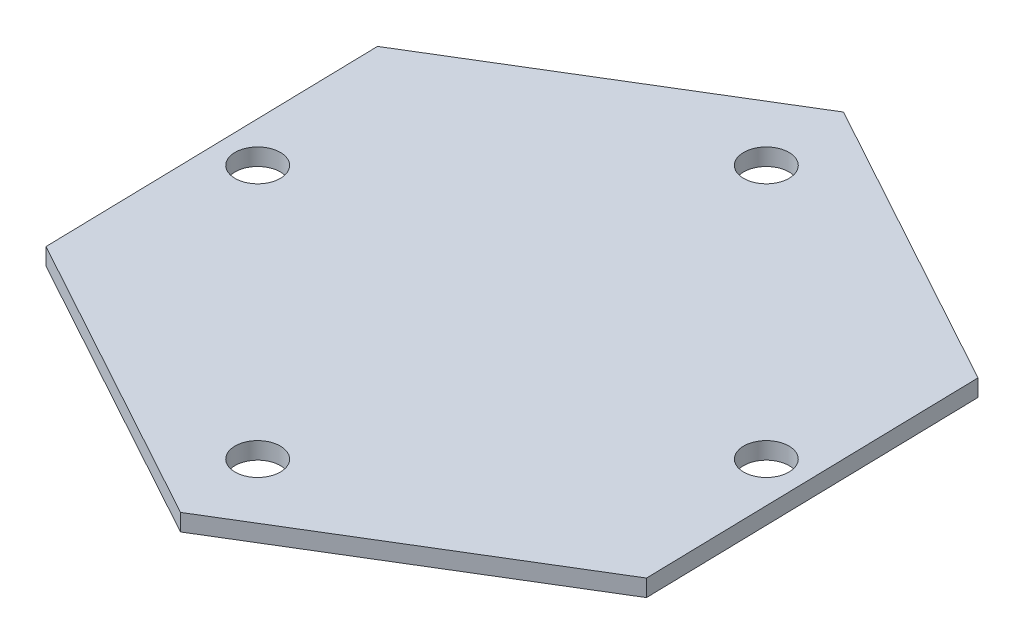
ISO-10303-21;
HEADER;
FILE_DESCRIPTION(('STEP AP214'),'2;1');
FILE_NAME('part.step','',(''),(''),'','','');
FILE_SCHEMA(('AUTOMOTIVE_DESIGN { 1 0 10303 214 1 1 1 1 }'));
ENDSEC;
DATA;
#1=APPLICATION_CONTEXT('core data for automotive mechanical design processes');
#2=APPLICATION_PROTOCOL_DEFINITION('international standard','automotive_design',2000,#1);
#3=PRODUCT_CONTEXT('',#1,'mechanical');
#4=PRODUCT('Part','Part','',(#3));
#5=PRODUCT_RELATED_PRODUCT_CATEGORY('part','',(#4));
#6=PRODUCT_DEFINITION_FORMATION('','',#4);
#7=PRODUCT_DEFINITION_CONTEXT('part definition',#1,'design');
#8=PRODUCT_DEFINITION('design','',#6,#7);
#9=PRODUCT_DEFINITION_SHAPE('','',#8);
#10=(LENGTH_UNIT() NAMED_UNIT(*) SI_UNIT(.MILLI.,.METRE.));
#11=(NAMED_UNIT(*) PLANE_ANGLE_UNIT() SI_UNIT($,.RADIAN.));
#12=(NAMED_UNIT(*) SI_UNIT($,.STERADIAN.) SOLID_ANGLE_UNIT());
#13=UNCERTAINTY_MEASURE_WITH_UNIT(LENGTH_MEASURE(1.E-05),#10,'distance_accuracy_value','');
#14=(GEOMETRIC_REPRESENTATION_CONTEXT(3) GLOBAL_UNCERTAINTY_ASSIGNED_CONTEXT((#13)) GLOBAL_UNIT_ASSIGNED_CONTEXT((#10,
#11,#12)) REPRESENTATION_CONTEXT('',''));
#15=CARTESIAN_POINT('',(0.,0.,0.));
#16=DIRECTION('',(0.,0.,1.));
#17=DIRECTION('',(1.,0.,0.));
#18=AXIS2_PLACEMENT_3D('',#15,#16,#17);
#19=CARTESIAN_POINT('',(1.34483275867379,3.,60.));
#20=DIRECTION('',(-0.519280566658144,0.,-0.854603822300835));
#21=DIRECTION('',(-0.854603822300835,0.,0.519280566658144));
#22=AXIS2_PLACEMENT_3D('',#19,#20,#21);
#23=PLANE('',#22);
#24=DIRECTION('',(0.854603822300835,0.,-0.519280566658144));
#25=VECTOR('',#24,1.);
#26=CARTESIAN_POINT('',(1.34483275867379,0.,60.));
#27=LINE('',#26,#25);
#28=CARTESIAN_POINT('',(1.34483275867379,0.,60.));
#29=VERTEX_POINT('',#28);
#30=CARTESIAN_POINT('',(52.6339406064032,0.,28.835340667147));
#31=VERTEX_POINT('',#30);
#32=EDGE_CURVE('E138',#29,#31,#27,.T.);
#33=ORIENTED_EDGE('',*,*,#32,.T.);
#34=DIRECTION('',(0.,-1.,0.));
#35=VECTOR('',#34,1.);
#36=CARTESIAN_POINT('',(52.6339406064032,3.,28.835340667147));
#37=LINE('',#36,#35);
#38=CARTESIAN_POINT('',(52.6339406064032,3.,28.835340667147));
#39=VERTEX_POINT('',#38);
#40=EDGE_CURVE('E11',#39,#31,#37,.T.);
#41=ORIENTED_EDGE('',*,*,#40,.F.);
#42=DIRECTION('',(0.854603822300835,0.,-0.519280566658144));
#43=VECTOR('',#42,1.);
#44=CARTESIAN_POINT('',(1.34483275867379,3.,60.));
#45=LINE('',#44,#43);
#46=CARTESIAN_POINT('',(1.34483275867379,3.,60.));
#47=VERTEX_POINT('',#46);
#48=EDGE_CURVE('E155',#47,#39,#45,.T.);
#49=ORIENTED_EDGE('',*,*,#48,.F.);
#50=DIRECTION('',(0.,-1.,0.));
#51=VECTOR('',#50,1.);
#52=CARTESIAN_POINT('',(1.34483275867379,3.,60.));
#53=LINE('',#52,#51);
#54=EDGE_CURVE('E134',#47,#29,#53,.T.);
#55=ORIENTED_EDGE('',*,*,#54,.T.);
#56=EDGE_LOOP('',(#33,#41,#49,#55));
#57=FACE_BOUND('',#56,.T.);
#58=ADVANCED_FACE('F49',(#57),#23,.F.);
#59=CARTESIAN_POINT('',(52.6339406064032,3.,28.835340667147));
#60=DIRECTION('',(-0.999748903612877,0.,0.0224082512671135));
#61=DIRECTION('',(0.0224082512671135,0.,0.999748903612877));
#62=AXIS2_PLACEMENT_3D('',#59,#60,#61);
#63=PLANE('',#62);
#64=DIRECTION('',(-0.0224082512671135,0.,-0.999748903612877));
#65=VECTOR('',#64,1.);
#66=CARTESIAN_POINT('',(52.6339406064032,0.,28.835340667147));
#67=LINE('',#66,#65);
#68=CARTESIAN_POINT('',(51.2891078477294,0.,-31.164659332853));
#69=VERTEX_POINT('',#68);
#70=EDGE_CURVE('E142',#31,#69,#67,.T.);
#71=ORIENTED_EDGE('',*,*,#70,.T.);
#72=DIRECTION('',(0.,-1.,0.));
#73=VECTOR('',#72,1.);
#74=CARTESIAN_POINT('',(51.2891078477294,3.,-31.164659332853));
#75=LINE('',#74,#73);
#76=CARTESIAN_POINT('',(51.2891078477294,3.,-31.164659332853));
#77=VERTEX_POINT('',#76);
#78=EDGE_CURVE('E58',#77,#69,#75,.T.);
#79=ORIENTED_EDGE('',*,*,#78,.F.);
#80=DIRECTION('',(-0.0224082512671135,0.,-0.999748903612877));
#81=VECTOR('',#80,1.);
#82=CARTESIAN_POINT('',(52.6339406064032,3.,28.835340667147));
#83=LINE('',#82,#81);
#84=EDGE_CURVE('E103',#39,#77,#83,.T.);
#85=ORIENTED_EDGE('',*,*,#84,.F.);
#86=ORIENTED_EDGE('',*,*,#40,.T.);
#87=EDGE_LOOP('',(#71,#79,#85,#86));
#88=FACE_BOUND('',#87,.T.);
#89=ADVANCED_FACE('F185',(#88),#63,.F.);
#90=CARTESIAN_POINT('',(51.2891078477294,3.,-31.164659332853));
#91=DIRECTION('',(-0.480468336954733,0.,0.877012073567948));
#92=DIRECTION('',(0.877012073567949,0.,0.480468336954734));
#93=AXIS2_PLACEMENT_3D('',#90,#91,#92);
#94=PLANE('',#93);
#95=DIRECTION('',(-0.877012073567949,0.,-0.480468336954734));
#96=VECTOR('',#95,1.);
#97=CARTESIAN_POINT('',(51.2891078477294,0.,-31.164659332853));
#98=LINE('',#97,#96);
#99=CARTESIAN_POINT('',(-1.34483275867379,0.,-60.));
#100=VERTEX_POINT('',#99);
#101=EDGE_CURVE('E146',#69,#100,#98,.T.);
#102=ORIENTED_EDGE('',*,*,#101,.T.);
#103=DIRECTION('',(0.,-1.,0.));
#104=VECTOR('',#103,1.);
#105=CARTESIAN_POINT('',(-1.34483275867379,3.,-60.));
#106=LINE('',#105,#104);
#107=CARTESIAN_POINT('',(-1.34483275867379,3.,-60.));
#108=VERTEX_POINT('',#107);
#109=EDGE_CURVE('E127',#108,#100,#106,.T.);
#110=ORIENTED_EDGE('',*,*,#109,.F.);
#111=DIRECTION('',(-0.877012073567949,0.,-0.480468336954734));
#112=VECTOR('',#111,1.);
#113=CARTESIAN_POINT('',(51.2891078477294,3.,-31.164659332853));
#114=LINE('',#113,#112);
#115=EDGE_CURVE('E116',#77,#108,#114,.T.);
#116=ORIENTED_EDGE('',*,*,#115,.F.);
#117=ORIENTED_EDGE('',*,*,#78,.T.);
#118=EDGE_LOOP('',(#102,#110,#116,#117));
#119=FACE_BOUND('',#118,.T.);
#120=ADVANCED_FACE('F165',(#119),#94,.F.);
#121=CARTESIAN_POINT('',(-1.34483275867379,3.,-60.));
#122=DIRECTION('',(0.519280566658144,0.,0.854603822300835));
#123=DIRECTION('',(0.854603822300835,0.,-0.519280566658144));
#124=AXIS2_PLACEMENT_3D('',#121,#122,#123);
#125=PLANE('',#124);
#126=DIRECTION('',(-0.854603822300835,0.,0.519280566658144));
#127=VECTOR('',#126,1.);
#128=CARTESIAN_POINT('',(-1.34483275867379,0.,-60.));
#129=LINE('',#128,#127);
#130=CARTESIAN_POINT('',(-52.6339406064032,0.,-28.835340667147));
#131=VERTEX_POINT('',#130);
#132=EDGE_CURVE('E125',#100,#131,#129,.T.);
#133=ORIENTED_EDGE('',*,*,#132,.T.);
#134=DIRECTION('',(0.,-1.,0.));
#135=VECTOR('',#134,1.);
#136=CARTESIAN_POINT('',(-52.6339406064032,3.,-28.835340667147));
#137=LINE('',#136,#135);
#138=CARTESIAN_POINT('',(-52.6339406064032,3.,-28.835340667147));
#139=VERTEX_POINT('',#138);
#140=EDGE_CURVE('E122',#139,#131,#137,.T.);
#141=ORIENTED_EDGE('',*,*,#140,.F.);
#142=DIRECTION('',(-0.854603822300835,0.,0.519280566658144));
#143=VECTOR('',#142,1.);
#144=CARTESIAN_POINT('',(-1.34483275867379,3.,-60.));
#145=LINE('',#144,#143);
#146=EDGE_CURVE('E110',#108,#139,#145,.T.);
#147=ORIENTED_EDGE('',*,*,#146,.F.);
#148=ORIENTED_EDGE('',*,*,#109,.T.);
#149=EDGE_LOOP('',(#133,#141,#147,#148));
#150=FACE_BOUND('',#149,.T.);
#151=ADVANCED_FACE('F123',(#150),#125,.F.);
#152=CARTESIAN_POINT('',(-52.6339406064032,3.,-28.835340667147));
#153=DIRECTION('',(0.999748903612877,0.,-0.0224082512671132));
#154=DIRECTION('',(-0.0224082512671132,0.,-0.999748903612877));
#155=AXIS2_PLACEMENT_3D('',#152,#153,#154);
#156=PLANE('',#155);
#157=DIRECTION('',(0.0224082512671132,0.,0.999748903612877));
#158=VECTOR('',#157,1.);
#159=CARTESIAN_POINT('',(-52.6339406064032,0.,-28.835340667147));
#160=LINE('',#159,#158);
#161=CARTESIAN_POINT('',(-51.2891078477294,0.,31.164659332853));
#162=VERTEX_POINT('',#161);
#163=EDGE_CURVE('E89',#131,#162,#160,.T.);
#164=ORIENTED_EDGE('',*,*,#163,.T.);
#165=DIRECTION('',(0.,-1.,0.));
#166=VECTOR('',#165,1.);
#167=CARTESIAN_POINT('',(-51.2891078477294,3.,31.164659332853));
#168=LINE('',#167,#166);
#169=CARTESIAN_POINT('',(-51.2891078477294,3.,31.164659332853));
#170=VERTEX_POINT('',#169);
#171=EDGE_CURVE('E128',#170,#162,#168,.T.);
#172=ORIENTED_EDGE('',*,*,#171,.F.);
#173=DIRECTION('',(0.0224082512671132,0.,0.999748903612877));
#174=VECTOR('',#173,1.);
#175=CARTESIAN_POINT('',(-52.6339406064032,3.,-28.835340667147));
#176=LINE('',#175,#174);
#177=EDGE_CURVE('E114',#139,#170,#176,.T.);
#178=ORIENTED_EDGE('',*,*,#177,.F.);
#179=ORIENTED_EDGE('',*,*,#140,.T.);
#180=EDGE_LOOP('',(#164,#172,#178,#179));
#181=FACE_BOUND('',#180,.T.);
#182=ADVANCED_FACE('F130',(#181),#156,.F.);
#183=CARTESIAN_POINT('',(-51.2891078477294,3.,31.164659332853));
#184=DIRECTION('',(0.480468336954733,0.,-0.877012073567948));
#185=DIRECTION('',(-0.877012073567949,0.,-0.480468336954734));
#186=AXIS2_PLACEMENT_3D('',#183,#184,#185);
#187=PLANE('',#186);
#188=DIRECTION('',(0.877012073567949,0.,0.480468336954734));
#189=VECTOR('',#188,1.);
#190=CARTESIAN_POINT('',(-51.2891078477294,0.,31.164659332853));
#191=LINE('',#190,#189);
#192=EDGE_CURVE('E95',#162,#29,#191,.T.);
#193=ORIENTED_EDGE('',*,*,#192,.T.);
#194=ORIENTED_EDGE('',*,*,#54,.F.);
#195=DIRECTION('',(0.877012073567949,0.,0.480468336954734));
#196=VECTOR('',#195,1.);
#197=CARTESIAN_POINT('',(-51.2891078477294,3.,31.164659332853));
#198=LINE('',#197,#196);
#199=EDGE_CURVE('E66',#170,#47,#198,.T.);
#200=ORIENTED_EDGE('',*,*,#199,.F.);
#201=ORIENTED_EDGE('',*,*,#171,.T.);
#202=EDGE_LOOP('',(#193,#194,#200,#201));
#203=FACE_BOUND('',#202,.T.);
#204=ADVANCED_FACE('F172',(#203),#187,.F.);
#205=CARTESIAN_POINT('',(0.,3.,0.));
#206=DIRECTION('',(0.,1.,0.));
#207=DIRECTION('',(0.,0.,1.));
#208=AXIS2_PLACEMENT_3D('',#205,#206,#207);
#209=PLANE('',#208);
#210=CARTESIAN_POINT('',(-45.,3.,0.));
#211=DIRECTION('',(0.,1.,0.));
#212=DIRECTION('',(0.,0.,1.));
#213=AXIS2_PLACEMENT_3D('',#210,#211,#212);
#214=CIRCLE('',#213,4.00000000000001);
#215=CARTESIAN_POINT('',(-45.,3.,4.00000000000001));
#216=VERTEX_POINT('',#215);
#217=EDGE_CURVE('E271',#216,#216,#214,.T.);
#218=ORIENTED_EDGE('',*,*,#217,.F.);
#219=EDGE_LOOP('',(#218));
#220=FACE_BOUND('',#219,.T.);
#221=CARTESIAN_POINT('',(0.,3.,-45.));
#222=DIRECTION('',(0.,1.,0.));
#223=DIRECTION('',(0.,0.,1.));
#224=AXIS2_PLACEMENT_3D('',#221,#222,#223);
#225=CIRCLE('',#224,4.);
#226=CARTESIAN_POINT('',(0.,3.,-41.));
#227=VERTEX_POINT('',#226);
#228=EDGE_CURVE('E273',#227,#227,#225,.T.);
#229=ORIENTED_EDGE('',*,*,#228,.F.);
#230=EDGE_LOOP('',(#229));
#231=FACE_BOUND('',#230,.T.);
#232=CARTESIAN_POINT('',(45.,3.,0.));
#233=DIRECTION('',(0.,1.,0.));
#234=DIRECTION('',(0.,0.,1.));
#235=AXIS2_PLACEMENT_3D('',#232,#233,#234);
#236=CIRCLE('',#235,4.00000000000001);
#237=CARTESIAN_POINT('',(45.,3.,4.00000000000001));
#238=VERTEX_POINT('',#237);
#239=EDGE_CURVE('E285',#238,#238,#236,.T.);
#240=ORIENTED_EDGE('',*,*,#239,.F.);
#241=EDGE_LOOP('',(#240));
#242=FACE_BOUND('',#241,.T.);
#243=CARTESIAN_POINT('',(0.,3.,45.));
#244=DIRECTION('',(0.,1.,0.));
#245=DIRECTION('',(0.,0.,1.));
#246=AXIS2_PLACEMENT_3D('',#243,#244,#245);
#247=CIRCLE('',#246,4.);
#248=CARTESIAN_POINT('',(0.,3.,49.));
#249=VERTEX_POINT('',#248);
#250=EDGE_CURVE('E293',#249,#249,#247,.T.);
#251=ORIENTED_EDGE('',*,*,#250,.F.);
#252=EDGE_LOOP('',(#251));
#253=FACE_BOUND('',#252,.T.);
#254=ORIENTED_EDGE('',*,*,#48,.T.);
#255=ORIENTED_EDGE('',*,*,#84,.T.);
#256=ORIENTED_EDGE('',*,*,#115,.T.);
#257=ORIENTED_EDGE('',*,*,#146,.T.);
#258=ORIENTED_EDGE('',*,*,#177,.T.);
#259=ORIENTED_EDGE('',*,*,#199,.T.);
#260=EDGE_LOOP('',(#254,#255,#256,#257,#258,#259));
#261=FACE_BOUND('',#260,.T.);
#262=ADVANCED_FACE('F112',(#220,#231,#242,#253,#261),#209,.T.);
#263=CARTESIAN_POINT('',(0.,0.,0.));
#264=DIRECTION('',(0.,1.,0.));
#265=DIRECTION('',(0.,0.,1.));
#266=AXIS2_PLACEMENT_3D('',#263,#264,#265);
#267=PLANE('',#266);
#268=CARTESIAN_POINT('',(-45.,0.,0.));
#269=DIRECTION('',(0.,1.,0.));
#270=DIRECTION('',(0.,0.,1.));
#271=AXIS2_PLACEMENT_3D('',#268,#269,#270);
#272=CIRCLE('',#271,4.00000000000001);
#273=CARTESIAN_POINT('',(-45.,0.,4.00000000000001));
#274=VERTEX_POINT('',#273);
#275=EDGE_CURVE('E143',#274,#274,#272,.T.);
#276=ORIENTED_EDGE('',*,*,#275,.T.);
#277=EDGE_LOOP('',(#276));
#278=FACE_BOUND('',#277,.T.);
#279=CARTESIAN_POINT('',(0.,0.,-45.));
#280=DIRECTION('',(0.,1.,0.));
#281=DIRECTION('',(0.,0.,1.));
#282=AXIS2_PLACEMENT_3D('',#279,#280,#281);
#283=CIRCLE('',#282,4.);
#284=CARTESIAN_POINT('',(0.,0.,-41.));
#285=VERTEX_POINT('',#284);
#286=EDGE_CURVE('E279',#285,#285,#283,.T.);
#287=ORIENTED_EDGE('',*,*,#286,.T.);
#288=EDGE_LOOP('',(#287));
#289=FACE_BOUND('',#288,.T.);
#290=CARTESIAN_POINT('',(45.,0.,0.));
#291=DIRECTION('',(0.,1.,0.));
#292=DIRECTION('',(0.,0.,1.));
#293=AXIS2_PLACEMENT_3D('',#290,#291,#292);
#294=CIRCLE('',#293,4.00000000000001);
#295=CARTESIAN_POINT('',(45.,0.,4.00000000000001));
#296=VERTEX_POINT('',#295);
#297=EDGE_CURVE('E289',#296,#296,#294,.T.);
#298=ORIENTED_EDGE('',*,*,#297,.T.);
#299=EDGE_LOOP('',(#298));
#300=FACE_BOUND('',#299,.T.);
#301=CARTESIAN_POINT('',(0.,0.,45.));
#302=DIRECTION('',(0.,1.,0.));
#303=DIRECTION('',(0.,0.,1.));
#304=AXIS2_PLACEMENT_3D('',#301,#302,#303);
#305=CIRCLE('',#304,4.);
#306=CARTESIAN_POINT('',(0.,0.,49.));
#307=VERTEX_POINT('',#306);
#308=EDGE_CURVE('E297',#307,#307,#305,.T.);
#309=ORIENTED_EDGE('',*,*,#308,.T.);
#310=EDGE_LOOP('',(#309));
#311=FACE_BOUND('',#310,.T.);
#312=ORIENTED_EDGE('',*,*,#32,.F.);
#313=ORIENTED_EDGE('',*,*,#192,.F.);
#314=ORIENTED_EDGE('',*,*,#163,.F.);
#315=ORIENTED_EDGE('',*,*,#132,.F.);
#316=ORIENTED_EDGE('',*,*,#101,.F.);
#317=ORIENTED_EDGE('',*,*,#70,.F.);
#318=EDGE_LOOP('',(#312,#313,#314,#315,#316,#317));
#319=FACE_BOUND('',#318,.T.);
#320=ADVANCED_FACE('F168',(#278,#289,#300,#311,#319),#267,.F.);
#321=CARTESIAN_POINT('',(0.,0.,45.));
#322=DIRECTION('',(0.,1.,0.));
#323=DIRECTION('',(0.,0.,1.));
#324=AXIS2_PLACEMENT_3D('',#321,#322,#323);
#325=CYLINDRICAL_SURFACE('',#324,4.);
#326=ORIENTED_EDGE('',*,*,#308,.F.);
#327=EDGE_LOOP('',(#326));
#328=FACE_BOUND('',#327,.T.);
#329=ORIENTED_EDGE('',*,*,#250,.T.);
#330=EDGE_LOOP('',(#329));
#331=FACE_BOUND('',#330,.T.);
#332=ADVANCED_FACE('F224',(#328,#331),#325,.F.);
#333=CARTESIAN_POINT('',(45.,0.,0.));
#334=DIRECTION('',(0.,1.,0.));
#335=DIRECTION('',(0.,0.,1.));
#336=AXIS2_PLACEMENT_3D('',#333,#334,#335);
#337=CYLINDRICAL_SURFACE('',#336,4.00000000000001);
#338=ORIENTED_EDGE('',*,*,#297,.F.);
#339=EDGE_LOOP('',(#338));
#340=FACE_BOUND('',#339,.T.);
#341=ORIENTED_EDGE('',*,*,#239,.T.);
#342=EDGE_LOOP('',(#341));
#343=FACE_BOUND('',#342,.T.);
#344=ADVANCED_FACE('F233',(#340,#343),#337,.F.);
#345=CARTESIAN_POINT('',(0.,0.,-45.));
#346=DIRECTION('',(0.,1.,0.));
#347=DIRECTION('',(0.,0.,1.));
#348=AXIS2_PLACEMENT_3D('',#345,#346,#347);
#349=CYLINDRICAL_SURFACE('',#348,4.);
#350=ORIENTED_EDGE('',*,*,#286,.F.);
#351=EDGE_LOOP('',(#350));
#352=FACE_BOUND('',#351,.T.);
#353=ORIENTED_EDGE('',*,*,#228,.T.);
#354=EDGE_LOOP('',(#353));
#355=FACE_BOUND('',#354,.T.);
#356=ADVANCED_FACE('F243',(#352,#355),#349,.F.);
#357=CARTESIAN_POINT('',(-45.,0.,0.));
#358=DIRECTION('',(0.,1.,0.));
#359=DIRECTION('',(0.,0.,1.));
#360=AXIS2_PLACEMENT_3D('',#357,#358,#359);
#361=CYLINDRICAL_SURFACE('',#360,4.00000000000001);
#362=ORIENTED_EDGE('',*,*,#275,.F.);
#363=EDGE_LOOP('',(#362));
#364=FACE_BOUND('',#363,.T.);
#365=ORIENTED_EDGE('',*,*,#217,.T.);
#366=EDGE_LOOP('',(#365));
#367=FACE_BOUND('',#366,.T.);
#368=ADVANCED_FACE('F253',(#364,#367),#361,.F.);
#369=CLOSED_SHELL('',(#58,#89,#120,#151,#182,#204,#262,#320,#332,#344,#356,#368));
#370=MANIFOLD_SOLID_BREP('B2',#369);
#371=ADVANCED_BREP_SHAPE_REPRESENTATION('',(#18,#370),#14);
#372=SHAPE_DEFINITION_REPRESENTATION(#9,#371);
ENDSEC;
END-ISO-10303-21;
